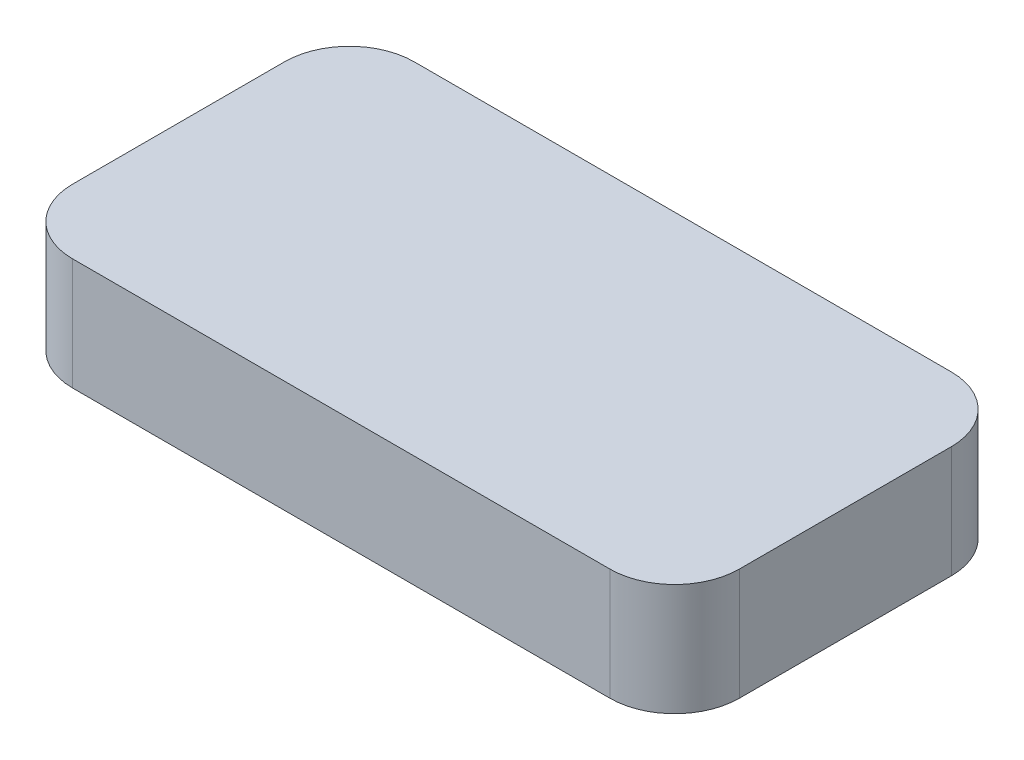
ISO-10303-21;
HEADER;
FILE_DESCRIPTION(('STEP AP214'),'2;1');
FILE_NAME('part.step','',(''),(''),'','','');
FILE_SCHEMA(('AUTOMOTIVE_DESIGN { 1 0 10303 214 1 1 1 1 }'));
ENDSEC;
DATA;
#1=APPLICATION_CONTEXT('core data for automotive mechanical design processes');
#2=APPLICATION_PROTOCOL_DEFINITION('international standard','automotive_design',2000,#1);
#3=PRODUCT_CONTEXT('',#1,'mechanical');
#4=PRODUCT('Part','Part','',(#3));
#5=PRODUCT_RELATED_PRODUCT_CATEGORY('part','',(#4));
#6=PRODUCT_DEFINITION_FORMATION('','',#4);
#7=PRODUCT_DEFINITION_CONTEXT('part definition',#1,'design');
#8=PRODUCT_DEFINITION('design','',#6,#7);
#9=PRODUCT_DEFINITION_SHAPE('','',#8);
#10=(LENGTH_UNIT() NAMED_UNIT(*) SI_UNIT(.MILLI.,.METRE.));
#11=(NAMED_UNIT(*) PLANE_ANGLE_UNIT() SI_UNIT($,.RADIAN.));
#12=(NAMED_UNIT(*) SI_UNIT($,.STERADIAN.) SOLID_ANGLE_UNIT());
#13=UNCERTAINTY_MEASURE_WITH_UNIT(LENGTH_MEASURE(1.E-05),#10,'distance_accuracy_value','');
#14=(GEOMETRIC_REPRESENTATION_CONTEXT(3) GLOBAL_UNCERTAINTY_ASSIGNED_CONTEXT((#13)) GLOBAL_UNIT_ASSIGNED_CONTEXT((#10,
#11,#12)) REPRESENTATION_CONTEXT('',''));
#15=CARTESIAN_POINT('',(0.,0.,0.));
#16=DIRECTION('',(0.,0.,1.));
#17=DIRECTION('',(1.,0.,0.));
#18=AXIS2_PLACEMENT_3D('',#15,#16,#17);
#19=CARTESIAN_POINT('',(0.,-4.915,0.));
#20=DIRECTION('',(0.,-1.,0.));
#21=DIRECTION('',(0.,0.,-1.));
#22=AXIS2_PLACEMENT_3D('',#19,#20,#21);
#23=PLANE('',#22);
#24=DIRECTION('',(0.,0.,-1.));
#25=VECTOR('',#24,1.);
#26=CARTESIAN_POINT('',(20.6,-4.915,0.));
#27=LINE('',#26,#25);
#28=CARTESIAN_POINT('',(20.6,-4.915,6.55));
#29=VERTEX_POINT('',#28);
#30=CARTESIAN_POINT('',(20.6,-4.915,-6.55));
#31=VERTEX_POINT('',#30);
#32=EDGE_CURVE('E11',#29,#31,#27,.T.);
#33=ORIENTED_EDGE('',*,*,#32,.F.);
#34=CARTESIAN_POINT('',(16.6,-4.915,6.55));
#35=DIRECTION('',(0.,-1.,0.));
#36=DIRECTION('',(0.,0.,-1.));
#37=AXIS2_PLACEMENT_3D('',#34,#35,#36);
#38=CIRCLE('',#37,4.);
#39=CARTESIAN_POINT('',(16.6,-4.915,10.55));
#40=VERTEX_POINT('',#39);
#41=EDGE_CURVE('E119',#29,#40,#38,.T.);
#42=ORIENTED_EDGE('',*,*,#41,.T.);
#43=DIRECTION('',(1.,0.,0.));
#44=VECTOR('',#43,1.);
#45=CARTESIAN_POINT('',(0.,-4.915,10.55));
#46=LINE('',#45,#44);
#47=CARTESIAN_POINT('',(-16.6,-4.915,10.55));
#48=VERTEX_POINT('',#47);
#49=EDGE_CURVE('E114',#48,#40,#46,.T.);
#50=ORIENTED_EDGE('',*,*,#49,.F.);
#51=CARTESIAN_POINT('',(-16.6,-4.915,6.55));
#52=DIRECTION('',(0.,-1.,0.));
#53=DIRECTION('',(0.,0.,-1.));
#54=AXIS2_PLACEMENT_3D('',#51,#52,#53);
#55=CIRCLE('',#54,4.);
#56=CARTESIAN_POINT('',(-20.6,-4.915,6.55));
#57=VERTEX_POINT('',#56);
#58=EDGE_CURVE('E108',#48,#57,#55,.T.);
#59=ORIENTED_EDGE('',*,*,#58,.T.);
#60=DIRECTION('',(0.,0.,1.));
#61=VECTOR('',#60,1.);
#62=CARTESIAN_POINT('',(-20.6,-4.915,0.));
#63=LINE('',#62,#61);
#64=CARTESIAN_POINT('',(-20.6,-4.915,-6.55));
#65=VERTEX_POINT('',#64);
#66=EDGE_CURVE('E112',#65,#57,#63,.T.);
#67=ORIENTED_EDGE('',*,*,#66,.F.);
#68=CARTESIAN_POINT('',(-16.6,-4.915,-6.55));
#69=DIRECTION('',(0.,-1.,0.));
#70=DIRECTION('',(0.,0.,-1.));
#71=AXIS2_PLACEMENT_3D('',#68,#69,#70);
#72=CIRCLE('',#71,4.);
#73=CARTESIAN_POINT('',(-16.6,-4.915,-10.55));
#74=VERTEX_POINT('',#73);
#75=EDGE_CURVE('E107',#65,#74,#72,.T.);
#76=ORIENTED_EDGE('',*,*,#75,.T.);
#77=DIRECTION('',(-1.,0.,0.));
#78=VECTOR('',#77,1.);
#79=CARTESIAN_POINT('',(0.,-4.915,-10.55));
#80=LINE('',#79,#78);
#81=CARTESIAN_POINT('',(16.6,-4.915,-10.55));
#82=VERTEX_POINT('',#81);
#83=EDGE_CURVE('E42',#82,#74,#80,.T.);
#84=ORIENTED_EDGE('',*,*,#83,.F.);
#85=CARTESIAN_POINT('',(16.6,-4.915,-6.55));
#86=DIRECTION('',(0.,-1.,0.));
#87=DIRECTION('',(0.,0.,-1.));
#88=AXIS2_PLACEMENT_3D('',#85,#86,#87);
#89=CIRCLE('',#88,4.);
#90=EDGE_CURVE('E37',#82,#31,#89,.T.);
#91=ORIENTED_EDGE('',*,*,#90,.T.);
#92=EDGE_LOOP('',(#33,#42,#50,#59,#67,#76,#84,#91));
#93=FACE_BOUND('',#92,.T.);
#94=CARTESIAN_POINT('',(16.6,-4.915,6.55));
#95=DIRECTION('',(0.,-1.,0.));
#96=DIRECTION('',(0.,0.,-1.));
#97=AXIS2_PLACEMENT_3D('',#94,#95,#96);
#98=CIRCLE('',#97,2.);
#99=CARTESIAN_POINT('',(18.6,-4.915,6.55));
#100=VERTEX_POINT('',#99);
#101=CARTESIAN_POINT('',(16.6,-4.915,8.55));
#102=VERTEX_POINT('',#101);
#103=EDGE_CURVE('E168',#100,#102,#98,.T.);
#104=ORIENTED_EDGE('',*,*,#103,.F.);
#105=DIRECTION('',(0.,0.,-1.));
#106=VECTOR('',#105,1.);
#107=CARTESIAN_POINT('',(18.6,-4.915,8.55));
#108=LINE('',#107,#106);
#109=CARTESIAN_POINT('',(18.6,-4.915,-6.55));
#110=VERTEX_POINT('',#109);
#111=EDGE_CURVE('E140',#100,#110,#108,.T.);
#112=ORIENTED_EDGE('',*,*,#111,.T.);
#113=CARTESIAN_POINT('',(16.6,-4.915,-6.55));
#114=DIRECTION('',(0.,-1.,0.));
#115=DIRECTION('',(0.,0.,-1.));
#116=AXIS2_PLACEMENT_3D('',#113,#114,#115);
#117=CIRCLE('',#116,2.);
#118=CARTESIAN_POINT('',(16.6,-4.915,-8.55));
#119=VERTEX_POINT('',#118);
#120=EDGE_CURVE('E217',#119,#110,#117,.T.);
#121=ORIENTED_EDGE('',*,*,#120,.F.);
#122=DIRECTION('',(-1.,0.,0.));
#123=VECTOR('',#122,1.);
#124=CARTESIAN_POINT('',(-18.6,-4.915,-8.55));
#125=LINE('',#124,#123);
#126=CARTESIAN_POINT('',(-16.6,-4.915,-8.55));
#127=VERTEX_POINT('',#126);
#128=EDGE_CURVE('E50',#119,#127,#125,.T.);
#129=ORIENTED_EDGE('',*,*,#128,.T.);
#130=CARTESIAN_POINT('',(-16.6,-4.915,-6.55));
#131=DIRECTION('',(0.,-1.,0.));
#132=DIRECTION('',(0.,0.,-1.));
#133=AXIS2_PLACEMENT_3D('',#130,#131,#132);
#134=CIRCLE('',#133,2.);
#135=CARTESIAN_POINT('',(-18.6,-4.915,-6.55));
#136=VERTEX_POINT('',#135);
#137=EDGE_CURVE('E164',#136,#127,#134,.T.);
#138=ORIENTED_EDGE('',*,*,#137,.F.);
#139=DIRECTION('',(0.,0.,1.));
#140=VECTOR('',#139,1.);
#141=CARTESIAN_POINT('',(-18.6,-4.915,8.55));
#142=LINE('',#141,#140);
#143=CARTESIAN_POINT('',(-18.6,-4.915,6.55));
#144=VERTEX_POINT('',#143);
#145=EDGE_CURVE('E210',#136,#144,#142,.T.);
#146=ORIENTED_EDGE('',*,*,#145,.T.);
#147=CARTESIAN_POINT('',(-16.6,-4.915,6.55));
#148=DIRECTION('',(0.,-1.,0.));
#149=DIRECTION('',(0.,0.,-1.));
#150=AXIS2_PLACEMENT_3D('',#147,#148,#149);
#151=CIRCLE('',#150,2.);
#152=CARTESIAN_POINT('',(-16.6,-4.915,8.55));
#153=VERTEX_POINT('',#152);
#154=EDGE_CURVE('E220',#153,#144,#151,.T.);
#155=ORIENTED_EDGE('',*,*,#154,.F.);
#156=DIRECTION('',(1.,0.,0.));
#157=VECTOR('',#156,1.);
#158=CARTESIAN_POINT('',(-18.6,-4.915,8.55));
#159=LINE('',#158,#157);
#160=EDGE_CURVE('E160',#153,#102,#159,.T.);
#161=ORIENTED_EDGE('',*,*,#160,.T.);
#162=EDGE_LOOP('',(#104,#112,#121,#129,#138,#146,#155,#161));
#163=FACE_BOUND('',#162,.T.);
#164=ADVANCED_FACE('F33',(#93,#163),#23,.T.);
#165=CARTESIAN_POINT('',(0.,2.,0.));
#166=DIRECTION('',(0.,1.,0.));
#167=DIRECTION('',(0.,0.,1.));
#168=AXIS2_PLACEMENT_3D('',#165,#166,#167);
#169=PLANE('',#168);
#170=CARTESIAN_POINT('',(16.6,2.,6.55));
#171=DIRECTION('',(0.,1.,0.));
#172=DIRECTION('',(0.,0.,1.));
#173=AXIS2_PLACEMENT_3D('',#170,#171,#172);
#174=CIRCLE('',#173,4.);
#175=CARTESIAN_POINT('',(20.6,2.,6.55));
#176=VERTEX_POINT('',#175);
#177=CARTESIAN_POINT('',(16.6,2.,10.55));
#178=VERTEX_POINT('',#177);
#179=EDGE_CURVE('E145',#176,#178,#174,.F.);
#180=ORIENTED_EDGE('',*,*,#179,.F.);
#181=DIRECTION('',(0.,0.,-1.));
#182=VECTOR('',#181,1.);
#183=CARTESIAN_POINT('',(20.6,2.,8.55));
#184=LINE('',#183,#182);
#185=CARTESIAN_POINT('',(20.6,2.,-6.55));
#186=VERTEX_POINT('',#185);
#187=EDGE_CURVE('E151',#176,#186,#184,.T.);
#188=ORIENTED_EDGE('',*,*,#187,.T.);
#189=CARTESIAN_POINT('',(16.6,2.,-6.55));
#190=DIRECTION('',(0.,1.,0.));
#191=DIRECTION('',(0.,0.,1.));
#192=AXIS2_PLACEMENT_3D('',#189,#190,#191);
#193=CIRCLE('',#192,4.);
#194=CARTESIAN_POINT('',(16.6,2.,-10.55));
#195=VERTEX_POINT('',#194);
#196=EDGE_CURVE('E144',#195,#186,#193,.F.);
#197=ORIENTED_EDGE('',*,*,#196,.F.);
#198=DIRECTION('',(-1.,0.,0.));
#199=VECTOR('',#198,1.);
#200=CARTESIAN_POINT('',(-18.6,2.,-10.55));
#201=LINE('',#200,#199);
#202=CARTESIAN_POINT('',(-16.6,2.,-10.55));
#203=VERTEX_POINT('',#202);
#204=EDGE_CURVE('E95',#195,#203,#201,.T.);
#205=ORIENTED_EDGE('',*,*,#204,.T.);
#206=CARTESIAN_POINT('',(-16.6,2.,-6.55));
#207=DIRECTION('',(0.,1.,0.));
#208=DIRECTION('',(0.,0.,1.));
#209=AXIS2_PLACEMENT_3D('',#206,#207,#208);
#210=CIRCLE('',#209,4.);
#211=CARTESIAN_POINT('',(-20.6,2.,-6.55));
#212=VERTEX_POINT('',#211);
#213=EDGE_CURVE('E99',#212,#203,#210,.F.);
#214=ORIENTED_EDGE('',*,*,#213,.F.);
#215=DIRECTION('',(0.,0.,1.));
#216=VECTOR('',#215,1.);
#217=CARTESIAN_POINT('',(-20.6,2.,8.55));
#218=LINE('',#217,#216);
#219=CARTESIAN_POINT('',(-20.6,2.,6.55));
#220=VERTEX_POINT('',#219);
#221=EDGE_CURVE('E139',#212,#220,#218,.T.);
#222=ORIENTED_EDGE('',*,*,#221,.T.);
#223=CARTESIAN_POINT('',(-16.6,2.,6.55));
#224=DIRECTION('',(0.,1.,0.));
#225=DIRECTION('',(0.,0.,1.));
#226=AXIS2_PLACEMENT_3D('',#223,#224,#225);
#227=CIRCLE('',#226,4.);
#228=CARTESIAN_POINT('',(-16.6,2.,10.55));
#229=VERTEX_POINT('',#228);
#230=EDGE_CURVE('E141',#229,#220,#227,.F.);
#231=ORIENTED_EDGE('',*,*,#230,.F.);
#232=DIRECTION('',(1.,0.,0.));
#233=VECTOR('',#232,1.);
#234=CARTESIAN_POINT('',(-18.6,2.,10.55));
#235=LINE('',#234,#233);
#236=EDGE_CURVE('E136',#229,#178,#235,.T.);
#237=ORIENTED_EDGE('',*,*,#236,.T.);
#238=EDGE_LOOP('',(#180,#188,#197,#205,#214,#222,#231,#237));
#239=FACE_BOUND('',#238,.T.);
#240=ADVANCED_FACE('F301',(#239),#169,.T.);
#241=CARTESIAN_POINT('',(20.6,4.915,8.55));
#242=DIRECTION('',(-1.,0.,0.));
#243=DIRECTION('',(0.,0.,1.));
#244=AXIS2_PLACEMENT_3D('',#241,#242,#243);
#245=PLANE('',#244);
#246=ORIENTED_EDGE('',*,*,#187,.F.);
#247=DIRECTION('',(0.,1.,0.));
#248=VECTOR('',#247,1.);
#249=CARTESIAN_POINT('',(20.6,4.915,6.55));
#250=LINE('',#249,#248);
#251=EDGE_CURVE('E58',#176,#29,#250,.F.);
#252=ORIENTED_EDGE('',*,*,#251,.T.);
#253=ORIENTED_EDGE('',*,*,#32,.T.);
#254=DIRECTION('',(0.,1.,0.));
#255=VECTOR('',#254,1.);
#256=CARTESIAN_POINT('',(20.6,4.915,-6.55));
#257=LINE('',#256,#255);
#258=EDGE_CURVE('E104',#31,#186,#257,.T.);
#259=ORIENTED_EDGE('',*,*,#258,.T.);
#260=EDGE_LOOP('',(#246,#252,#253,#259));
#261=FACE_BOUND('',#260,.T.);
#262=ADVANCED_FACE('F310',(#261),#245,.F.);
#263=CARTESIAN_POINT('',(-18.6,4.915,-10.55));
#264=DIRECTION('',(0.,0.,1.));
#265=DIRECTION('',(1.,0.,0.));
#266=AXIS2_PLACEMENT_3D('',#263,#264,#265);
#267=PLANE('',#266);
#268=ORIENTED_EDGE('',*,*,#204,.F.);
#269=DIRECTION('',(0.,1.,0.));
#270=VECTOR('',#269,1.);
#271=CARTESIAN_POINT('',(16.6,4.915,-10.55));
#272=LINE('',#271,#270);
#273=EDGE_CURVE('E87',#195,#82,#272,.F.);
#274=ORIENTED_EDGE('',*,*,#273,.T.);
#275=ORIENTED_EDGE('',*,*,#83,.T.);
#276=DIRECTION('',(0.,1.,0.));
#277=VECTOR('',#276,1.);
#278=CARTESIAN_POINT('',(-16.6,4.915,-10.55));
#279=LINE('',#278,#277);
#280=EDGE_CURVE('E98',#74,#203,#279,.T.);
#281=ORIENTED_EDGE('',*,*,#280,.T.);
#282=EDGE_LOOP('',(#268,#274,#275,#281));
#283=FACE_BOUND('',#282,.T.);
#284=ADVANCED_FACE('F89',(#283),#267,.F.);
#285=CARTESIAN_POINT('',(-20.6,4.915,8.55));
#286=DIRECTION('',(1.,0.,0.));
#287=DIRECTION('',(0.,0.,-1.));
#288=AXIS2_PLACEMENT_3D('',#285,#286,#287);
#289=PLANE('',#288);
#290=ORIENTED_EDGE('',*,*,#221,.F.);
#291=DIRECTION('',(0.,1.,0.));
#292=VECTOR('',#291,1.);
#293=CARTESIAN_POINT('',(-20.6,4.915,-6.55));
#294=LINE('',#293,#292);
#295=EDGE_CURVE('E127',#212,#65,#294,.F.);
#296=ORIENTED_EDGE('',*,*,#295,.T.);
#297=ORIENTED_EDGE('',*,*,#66,.T.);
#298=DIRECTION('',(0.,1.,0.));
#299=VECTOR('',#298,1.);
#300=CARTESIAN_POINT('',(-20.6,4.915,6.55));
#301=LINE('',#300,#299);
#302=EDGE_CURVE('E129',#57,#220,#301,.T.);
#303=ORIENTED_EDGE('',*,*,#302,.T.);
#304=EDGE_LOOP('',(#290,#296,#297,#303));
#305=FACE_BOUND('',#304,.T.);
#306=ADVANCED_FACE('F304',(#305),#289,.F.);
#307=CARTESIAN_POINT('',(-16.6,4.915,-6.55));
#308=DIRECTION('',(0.,-1.,0.));
#309=DIRECTION('',(0.,0.,-1.));
#310=AXIS2_PLACEMENT_3D('',#307,#308,#309);
#311=CYLINDRICAL_SURFACE('',#310,4.);
#312=ORIENTED_EDGE('',*,*,#295,.F.);
#313=ORIENTED_EDGE('',*,*,#213,.T.);
#314=ORIENTED_EDGE('',*,*,#280,.F.);
#315=ORIENTED_EDGE('',*,*,#75,.F.);
#316=EDGE_LOOP('',(#312,#313,#314,#315));
#317=FACE_BOUND('',#316,.T.);
#318=ADVANCED_FACE('F360',(#317),#311,.T.);
#319=CARTESIAN_POINT('',(16.6,4.915,-6.55));
#320=DIRECTION('',(0.,-1.,0.));
#321=DIRECTION('',(0.,0.,-1.));
#322=AXIS2_PLACEMENT_3D('',#319,#320,#321);
#323=CYLINDRICAL_SURFACE('',#322,4.);
#324=ORIENTED_EDGE('',*,*,#273,.F.);
#325=ORIENTED_EDGE('',*,*,#196,.T.);
#326=ORIENTED_EDGE('',*,*,#258,.F.);
#327=ORIENTED_EDGE('',*,*,#90,.F.);
#328=EDGE_LOOP('',(#324,#325,#326,#327));
#329=FACE_BOUND('',#328,.T.);
#330=ADVANCED_FACE('F102',(#329),#323,.T.);
#331=CARTESIAN_POINT('',(-18.6,4.915,10.55));
#332=DIRECTION('',(0.,0.,-1.));
#333=DIRECTION('',(-1.,0.,0.));
#334=AXIS2_PLACEMENT_3D('',#331,#332,#333);
#335=PLANE('',#334);
#336=ORIENTED_EDGE('',*,*,#236,.F.);
#337=DIRECTION('',(0.,1.,0.));
#338=VECTOR('',#337,1.);
#339=CARTESIAN_POINT('',(-16.6,4.915,10.55));
#340=LINE('',#339,#338);
#341=EDGE_CURVE('E122',#229,#48,#340,.F.);
#342=ORIENTED_EDGE('',*,*,#341,.T.);
#343=ORIENTED_EDGE('',*,*,#49,.T.);
#344=DIRECTION('',(0.,1.,0.));
#345=VECTOR('',#344,1.);
#346=CARTESIAN_POINT('',(16.6,4.915,10.55));
#347=LINE('',#346,#345);
#348=EDGE_CURVE('E124',#40,#178,#347,.T.);
#349=ORIENTED_EDGE('',*,*,#348,.T.);
#350=EDGE_LOOP('',(#336,#342,#343,#349));
#351=FACE_BOUND('',#350,.T.);
#352=ADVANCED_FACE('F308',(#351),#335,.F.);
#353=CARTESIAN_POINT('',(-16.6,4.915,6.55));
#354=DIRECTION('',(0.,-1.,0.));
#355=DIRECTION('',(0.,0.,-1.));
#356=AXIS2_PLACEMENT_3D('',#353,#354,#355);
#357=CYLINDRICAL_SURFACE('',#356,4.);
#358=ORIENTED_EDGE('',*,*,#341,.F.);
#359=ORIENTED_EDGE('',*,*,#230,.T.);
#360=ORIENTED_EDGE('',*,*,#302,.F.);
#361=ORIENTED_EDGE('',*,*,#58,.F.);
#362=EDGE_LOOP('',(#358,#359,#360,#361));
#363=FACE_BOUND('',#362,.T.);
#364=ADVANCED_FACE('F298',(#363),#357,.T.);
#365=CARTESIAN_POINT('',(16.6,4.915,6.55));
#366=DIRECTION('',(0.,-1.,0.));
#367=DIRECTION('',(0.,0.,-1.));
#368=AXIS2_PLACEMENT_3D('',#365,#366,#367);
#369=CYLINDRICAL_SURFACE('',#368,4.);
#370=ORIENTED_EDGE('',*,*,#251,.F.);
#371=ORIENTED_EDGE('',*,*,#179,.T.);
#372=ORIENTED_EDGE('',*,*,#348,.F.);
#373=ORIENTED_EDGE('',*,*,#41,.F.);
#374=EDGE_LOOP('',(#370,#371,#372,#373));
#375=FACE_BOUND('',#374,.T.);
#376=ADVANCED_FACE('F35',(#375),#369,.T.);
#377=CARTESIAN_POINT('',(0.,0.,0.));
#378=DIRECTION('',(0.,1.,0.));
#379=DIRECTION('',(0.,0.,1.));
#380=AXIS2_PLACEMENT_3D('',#377,#378,#379);
#381=PLANE('',#380);
#382=CARTESIAN_POINT('',(16.6,0.,6.55));
#383=DIRECTION('',(0.,1.,0.));
#384=DIRECTION('',(0.,0.,1.));
#385=AXIS2_PLACEMENT_3D('',#382,#383,#384);
#386=CIRCLE('',#385,2.);
#387=CARTESIAN_POINT('',(18.6,0.,6.55));
#388=VERTEX_POINT('',#387);
#389=CARTESIAN_POINT('',(16.6,0.,8.55));
#390=VERTEX_POINT('',#389);
#391=EDGE_CURVE('E196',#388,#390,#386,.F.);
#392=ORIENTED_EDGE('',*,*,#391,.T.);
#393=DIRECTION('',(1.,0.,0.));
#394=VECTOR('',#393,1.);
#395=CARTESIAN_POINT('',(-18.6,0.,8.55));
#396=LINE('',#395,#394);
#397=CARTESIAN_POINT('',(-16.6,0.,8.55));
#398=VERTEX_POINT('',#397);
#399=EDGE_CURVE('E184',#398,#390,#396,.T.);
#400=ORIENTED_EDGE('',*,*,#399,.F.);
#401=CARTESIAN_POINT('',(-16.6,0.,6.55));
#402=DIRECTION('',(0.,1.,0.));
#403=DIRECTION('',(0.,0.,1.));
#404=AXIS2_PLACEMENT_3D('',#401,#402,#403);
#405=CIRCLE('',#404,2.);
#406=CARTESIAN_POINT('',(-18.6,0.,6.55));
#407=VERTEX_POINT('',#406);
#408=EDGE_CURVE('E199',#398,#407,#405,.F.);
#409=ORIENTED_EDGE('',*,*,#408,.T.);
#410=DIRECTION('',(0.,0.,1.));
#411=VECTOR('',#410,1.);
#412=CARTESIAN_POINT('',(-18.6,0.,8.55));
#413=LINE('',#412,#411);
#414=CARTESIAN_POINT('',(-18.6,0.,-6.55));
#415=VERTEX_POINT('',#414);
#416=EDGE_CURVE('E187',#415,#407,#413,.T.);
#417=ORIENTED_EDGE('',*,*,#416,.F.);
#418=CARTESIAN_POINT('',(-16.6,0.,-6.55));
#419=DIRECTION('',(0.,1.,0.));
#420=DIRECTION('',(0.,0.,1.));
#421=AXIS2_PLACEMENT_3D('',#418,#419,#420);
#422=CIRCLE('',#421,2.);
#423=CARTESIAN_POINT('',(-16.6,0.,-8.55));
#424=VERTEX_POINT('',#423);
#425=EDGE_CURVE('E183',#415,#424,#422,.F.);
#426=ORIENTED_EDGE('',*,*,#425,.T.);
#427=DIRECTION('',(-1.,0.,0.));
#428=VECTOR('',#427,1.);
#429=CARTESIAN_POINT('',(-18.6,0.,-8.55));
#430=LINE('',#429,#428);
#431=CARTESIAN_POINT('',(16.6,0.,-8.55));
#432=VERTEX_POINT('',#431);
#433=EDGE_CURVE('E190',#432,#424,#430,.T.);
#434=ORIENTED_EDGE('',*,*,#433,.F.);
#435=CARTESIAN_POINT('',(16.6,0.,-6.55));
#436=DIRECTION('',(0.,1.,0.));
#437=DIRECTION('',(0.,0.,1.));
#438=AXIS2_PLACEMENT_3D('',#435,#436,#437);
#439=CIRCLE('',#438,2.);
#440=CARTESIAN_POINT('',(18.6,0.,-6.55));
#441=VERTEX_POINT('',#440);
#442=EDGE_CURVE('E202',#432,#441,#439,.F.);
#443=ORIENTED_EDGE('',*,*,#442,.T.);
#444=DIRECTION('',(0.,0.,-1.));
#445=VECTOR('',#444,1.);
#446=CARTESIAN_POINT('',(18.6,0.,8.55));
#447=LINE('',#446,#445);
#448=EDGE_CURVE('E193',#388,#441,#447,.T.);
#449=ORIENTED_EDGE('',*,*,#448,.F.);
#450=EDGE_LOOP('',(#392,#400,#409,#417,#426,#434,#443,#449));
#451=FACE_BOUND('',#450,.T.);
#452=ADVANCED_FACE('F264',(#451),#381,.F.);
#453=CARTESIAN_POINT('',(18.6,4.915,8.55));
#454=DIRECTION('',(-1.,0.,0.));
#455=DIRECTION('',(0.,0.,1.));
#456=AXIS2_PLACEMENT_3D('',#453,#454,#455);
#457=PLANE('',#456);
#458=ORIENTED_EDGE('',*,*,#448,.T.);
#459=DIRECTION('',(0.,-1.,0.));
#460=VECTOR('',#459,1.);
#461=CARTESIAN_POINT('',(18.6,4.915,-6.55));
#462=LINE('',#461,#460);
#463=EDGE_CURVE('E157',#110,#441,#462,.F.);
#464=ORIENTED_EDGE('',*,*,#463,.F.);
#465=ORIENTED_EDGE('',*,*,#111,.F.);
#466=DIRECTION('',(0.,-1.,0.));
#467=VECTOR('',#466,1.);
#468=CARTESIAN_POINT('',(18.6,4.915,6.55));
#469=LINE('',#468,#467);
#470=EDGE_CURVE('E161',#388,#100,#469,.T.);
#471=ORIENTED_EDGE('',*,*,#470,.F.);
#472=EDGE_LOOP('',(#458,#464,#465,#471));
#473=FACE_BOUND('',#472,.T.);
#474=ADVANCED_FACE('F319',(#473),#457,.T.);
#475=CARTESIAN_POINT('',(-18.6,4.915,-8.55));
#476=DIRECTION('',(0.,0.,1.));
#477=DIRECTION('',(1.,0.,0.));
#478=AXIS2_PLACEMENT_3D('',#475,#476,#477);
#479=PLANE('',#478);
#480=ORIENTED_EDGE('',*,*,#433,.T.);
#481=DIRECTION('',(0.,-1.,0.));
#482=VECTOR('',#481,1.);
#483=CARTESIAN_POINT('',(-16.6,4.915,-8.55));
#484=LINE('',#483,#482);
#485=EDGE_CURVE('E178',#127,#424,#484,.F.);
#486=ORIENTED_EDGE('',*,*,#485,.F.);
#487=ORIENTED_EDGE('',*,*,#128,.F.);
#488=DIRECTION('',(0.,-1.,0.));
#489=VECTOR('',#488,1.);
#490=CARTESIAN_POINT('',(16.6,4.915,-8.55));
#491=LINE('',#490,#489);
#492=EDGE_CURVE('E181',#432,#119,#491,.T.);
#493=ORIENTED_EDGE('',*,*,#492,.F.);
#494=EDGE_LOOP('',(#480,#486,#487,#493));
#495=FACE_BOUND('',#494,.T.);
#496=ADVANCED_FACE('F340',(#495),#479,.T.);
#497=CARTESIAN_POINT('',(-18.6,4.915,8.55));
#498=DIRECTION('',(1.,0.,0.));
#499=DIRECTION('',(0.,0.,-1.));
#500=AXIS2_PLACEMENT_3D('',#497,#498,#499);
#501=PLANE('',#500);
#502=ORIENTED_EDGE('',*,*,#416,.T.);
#503=DIRECTION('',(0.,-1.,0.));
#504=VECTOR('',#503,1.);
#505=CARTESIAN_POINT('',(-18.6,4.915,6.55));
#506=LINE('',#505,#504);
#507=EDGE_CURVE('E175',#144,#407,#506,.F.);
#508=ORIENTED_EDGE('',*,*,#507,.F.);
#509=ORIENTED_EDGE('',*,*,#145,.F.);
#510=DIRECTION('',(0.,-1.,0.));
#511=VECTOR('',#510,1.);
#512=CARTESIAN_POINT('',(-18.6,4.915,-6.55));
#513=LINE('',#512,#511);
#514=EDGE_CURVE('E172',#415,#136,#513,.T.);
#515=ORIENTED_EDGE('',*,*,#514,.F.);
#516=EDGE_LOOP('',(#502,#508,#509,#515));
#517=FACE_BOUND('',#516,.T.);
#518=ADVANCED_FACE('F256',(#517),#501,.T.);
#519=CARTESIAN_POINT('',(-16.6,4.915,-6.55));
#520=DIRECTION('',(0.,-1.,0.));
#521=DIRECTION('',(0.,0.,-1.));
#522=AXIS2_PLACEMENT_3D('',#519,#520,#521);
#523=CYLINDRICAL_SURFACE('',#522,2.);
#524=ORIENTED_EDGE('',*,*,#514,.T.);
#525=ORIENTED_EDGE('',*,*,#137,.T.);
#526=ORIENTED_EDGE('',*,*,#485,.T.);
#527=ORIENTED_EDGE('',*,*,#425,.F.);
#528=EDGE_LOOP('',(#524,#525,#526,#527));
#529=FACE_BOUND('',#528,.T.);
#530=ADVANCED_FACE('F325',(#529),#523,.F.);
#531=CARTESIAN_POINT('',(16.6,4.915,-6.55));
#532=DIRECTION('',(0.,-1.,0.));
#533=DIRECTION('',(0.,0.,-1.));
#534=AXIS2_PLACEMENT_3D('',#531,#532,#533);
#535=CYLINDRICAL_SURFACE('',#534,2.);
#536=ORIENTED_EDGE('',*,*,#492,.T.);
#537=ORIENTED_EDGE('',*,*,#120,.T.);
#538=ORIENTED_EDGE('',*,*,#463,.T.);
#539=ORIENTED_EDGE('',*,*,#442,.F.);
#540=EDGE_LOOP('',(#536,#537,#538,#539));
#541=FACE_BOUND('',#540,.T.);
#542=ADVANCED_FACE('F328',(#541),#535,.F.);
#543=CARTESIAN_POINT('',(-18.6,4.915,8.55));
#544=DIRECTION('',(0.,0.,-1.));
#545=DIRECTION('',(-1.,0.,0.));
#546=AXIS2_PLACEMENT_3D('',#543,#544,#545);
#547=PLANE('',#546);
#548=ORIENTED_EDGE('',*,*,#399,.T.);
#549=DIRECTION('',(0.,-1.,0.));
#550=VECTOR('',#549,1.);
#551=CARTESIAN_POINT('',(16.6,4.915,8.55));
#552=LINE('',#551,#550);
#553=EDGE_CURVE('E169',#102,#390,#552,.F.);
#554=ORIENTED_EDGE('',*,*,#553,.F.);
#555=ORIENTED_EDGE('',*,*,#160,.F.);
#556=DIRECTION('',(0.,-1.,0.));
#557=VECTOR('',#556,1.);
#558=CARTESIAN_POINT('',(-16.6,4.915,8.55));
#559=LINE('',#558,#557);
#560=EDGE_CURVE('E165',#398,#153,#559,.T.);
#561=ORIENTED_EDGE('',*,*,#560,.F.);
#562=EDGE_LOOP('',(#548,#554,#555,#561));
#563=FACE_BOUND('',#562,.T.);
#564=ADVANCED_FACE('F239',(#563),#547,.T.);
#565=CARTESIAN_POINT('',(-16.6,4.915,6.55));
#566=DIRECTION('',(0.,-1.,0.));
#567=DIRECTION('',(0.,0.,-1.));
#568=AXIS2_PLACEMENT_3D('',#565,#566,#567);
#569=CYLINDRICAL_SURFACE('',#568,2.);
#570=ORIENTED_EDGE('',*,*,#560,.T.);
#571=ORIENTED_EDGE('',*,*,#154,.T.);
#572=ORIENTED_EDGE('',*,*,#507,.T.);
#573=ORIENTED_EDGE('',*,*,#408,.F.);
#574=EDGE_LOOP('',(#570,#571,#572,#573));
#575=FACE_BOUND('',#574,.T.);
#576=ADVANCED_FACE('F250',(#575),#569,.F.);
#577=CARTESIAN_POINT('',(16.6,4.915,6.55));
#578=DIRECTION('',(0.,-1.,0.));
#579=DIRECTION('',(0.,0.,-1.));
#580=AXIS2_PLACEMENT_3D('',#577,#578,#579);
#581=CYLINDRICAL_SURFACE('',#580,2.);
#582=ORIENTED_EDGE('',*,*,#470,.T.);
#583=ORIENTED_EDGE('',*,*,#103,.T.);
#584=ORIENTED_EDGE('',*,*,#553,.T.);
#585=ORIENTED_EDGE('',*,*,#391,.F.);
#586=EDGE_LOOP('',(#582,#583,#584,#585));
#587=FACE_BOUND('',#586,.T.);
#588=ADVANCED_FACE('F228',(#587),#581,.F.);
#589=CLOSED_SHELL('',(#164,#240,#262,#284,#306,#318,#330,#352,#364,#376,#452,#474,#496,#518,
#530,#542,#564,#576,#588));
#590=MANIFOLD_SOLID_BREP('B2',#589);
#591=ADVANCED_BREP_SHAPE_REPRESENTATION('',(#18,#590),#14);
#592=SHAPE_DEFINITION_REPRESENTATION(#9,#591);
ENDSEC;
END-ISO-10303-21;
